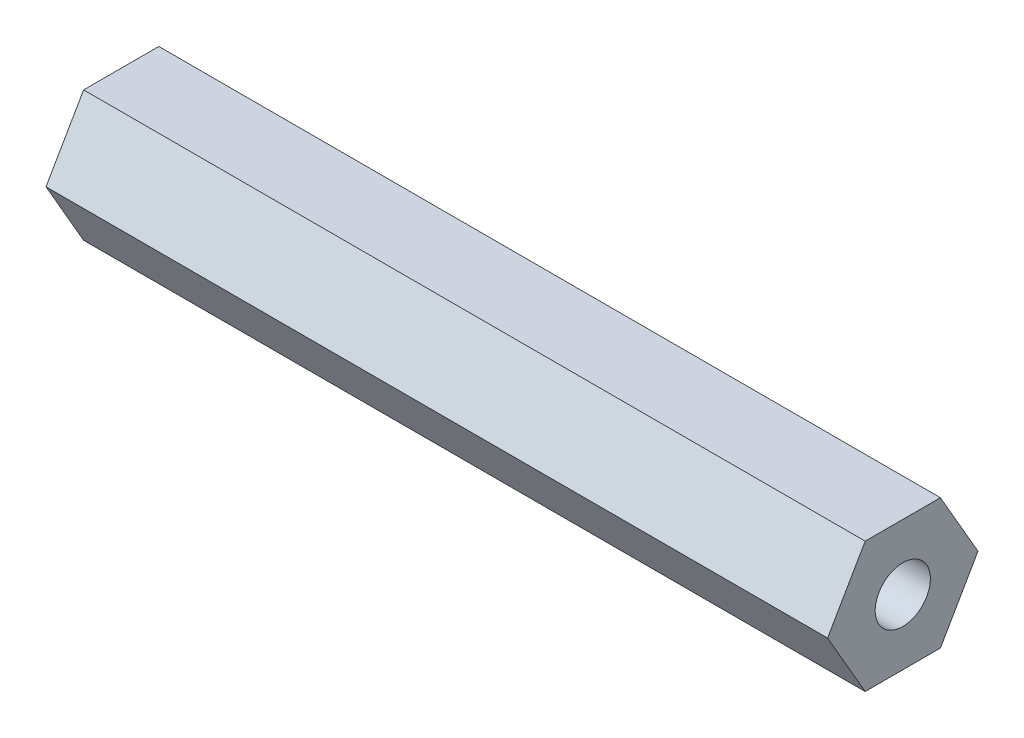
ISO-10303-21;
HEADER;
FILE_DESCRIPTION(('STEP AP214'),'2;1');
FILE_NAME('part.step','',(''),(''),'','','');
FILE_SCHEMA(('AUTOMOTIVE_DESIGN { 1 0 10303 214 1 1 1 1 }'));
ENDSEC;
DATA;
#1=APPLICATION_CONTEXT('core data for automotive mechanical design processes');
#2=APPLICATION_PROTOCOL_DEFINITION('international standard','automotive_design',2000,#1);
#3=PRODUCT_CONTEXT('',#1,'mechanical');
#4=PRODUCT('Part','Part','',(#3));
#5=PRODUCT_RELATED_PRODUCT_CATEGORY('part','',(#4));
#6=PRODUCT_DEFINITION_FORMATION('','',#4);
#7=PRODUCT_DEFINITION_CONTEXT('part definition',#1,'design');
#8=PRODUCT_DEFINITION('design','',#6,#7);
#9=PRODUCT_DEFINITION_SHAPE('','',#8);
#10=(LENGTH_UNIT() NAMED_UNIT(*) SI_UNIT(.MILLI.,.METRE.));
#11=(NAMED_UNIT(*) PLANE_ANGLE_UNIT() SI_UNIT($,.RADIAN.));
#12=(NAMED_UNIT(*) SI_UNIT($,.STERADIAN.) SOLID_ANGLE_UNIT());
#13=UNCERTAINTY_MEASURE_WITH_UNIT(LENGTH_MEASURE(1.E-05),#10,'distance_accuracy_value','');
#14=(GEOMETRIC_REPRESENTATION_CONTEXT(3) GLOBAL_UNCERTAINTY_ASSIGNED_CONTEXT((#13)) GLOBAL_UNIT_ASSIGNED_CONTEXT((#10,
#11,#12)) REPRESENTATION_CONTEXT('',''));
#15=CARTESIAN_POINT('',(0.,0.,0.));
#16=DIRECTION('',(0.,0.,1.));
#17=DIRECTION('',(1.,0.,0.));
#18=AXIS2_PLACEMENT_3D('',#15,#16,#17);
#19=CARTESIAN_POINT('',(38.1,0.,0.));
#20=DIRECTION('',(1.,0.,0.));
#21=DIRECTION('',(0.,1.,0.));
#22=AXIS2_PLACEMENT_3D('',#19,#20,#21);
#23=PLANE('',#22);
#24=CARTESIAN_POINT('',(38.1,0.,0.));
#25=DIRECTION('',(1.,0.,0.));
#26=DIRECTION('',(0.,0.,-1.));
#27=AXIS2_PLACEMENT_3D('',#24,#25,#26);
#28=CIRCLE('',#27,2.0193);
#29=CARTESIAN_POINT('',(38.1,0.,-2.0193));
#30=VERTEX_POINT('',#29);
#31=EDGE_CURVE('E172',#30,#30,#28,.T.);
#32=ORIENTED_EDGE('',*,*,#31,.F.);
#33=EDGE_LOOP('',(#32));
#34=FACE_BOUND('',#33,.T.);
#35=DIRECTION('',(0.,0.866025403784442,-0.5));
#36=VECTOR('',#35,1.);
#37=CARTESIAN_POINT('',(38.1,-4.7625,-2.74963065701564));
#38=LINE('',#37,#36);
#39=CARTESIAN_POINT('',(38.1,-4.7625,-2.74963065701564));
#40=VERTEX_POINT('',#39);
#41=CARTESIAN_POINT('',(38.1,0.,-5.49926131403117));
#42=VERTEX_POINT('',#41);
#43=EDGE_CURVE('E168',#40,#42,#38,.T.);
#44=ORIENTED_EDGE('',*,*,#43,.T.);
#45=DIRECTION('',(0.,0.866025403784438,0.5));
#46=VECTOR('',#45,1.);
#47=CARTESIAN_POINT('',(38.1,0.,-5.49926131403117));
#48=LINE('',#47,#46);
#49=CARTESIAN_POINT('',(38.1,4.7625,-2.74963065701557));
#50=VERTEX_POINT('',#49);
#51=EDGE_CURVE('E103',#42,#50,#48,.T.);
#52=ORIENTED_EDGE('',*,*,#51,.T.);
#53=DIRECTION('',(0.,0.,1.));
#54=VECTOR('',#53,1.);
#55=CARTESIAN_POINT('',(38.1,4.7625,-2.74963065701557));
#56=LINE('',#55,#54);
#57=CARTESIAN_POINT('',(38.1,4.7625,2.7496306570156));
#58=VERTEX_POINT('',#57);
#59=EDGE_CURVE('E145',#50,#58,#56,.T.);
#60=ORIENTED_EDGE('',*,*,#59,.T.);
#61=DIRECTION('',(0.,-0.866025403784442,0.5));
#62=VECTOR('',#61,1.);
#63=CARTESIAN_POINT('',(38.1,4.7625,2.7496306570156));
#64=LINE('',#63,#62);
#65=CARTESIAN_POINT('',(38.1,0.,5.49926131403117));
#66=VERTEX_POINT('',#65);
#67=EDGE_CURVE('E142',#58,#66,#64,.T.);
#68=ORIENTED_EDGE('',*,*,#67,.T.);
#69=DIRECTION('',(0.,-0.866025403784435,-0.500000000000007));
#70=VECTOR('',#69,1.);
#71=CARTESIAN_POINT('',(38.1,0.,5.49926131403117));
#72=LINE('',#71,#70);
#73=CARTESIAN_POINT('',(38.1,-4.7625,2.74963065701554));
#74=VERTEX_POINT('',#73);
#75=EDGE_CURVE('E163',#66,#74,#72,.T.);
#76=ORIENTED_EDGE('',*,*,#75,.T.);
#77=DIRECTION('',(0.,0.,-1.));
#78=VECTOR('',#77,1.);
#79=CARTESIAN_POINT('',(38.1,-4.7625,2.74963065701554));
#80=LINE('',#79,#78);
#81=EDGE_CURVE('E56',#74,#40,#80,.T.);
#82=ORIENTED_EDGE('',*,*,#81,.T.);
#83=EDGE_LOOP('',(#44,#52,#60,#68,#76,#82));
#84=FACE_BOUND('',#83,.T.);
#85=ADVANCED_FACE('F47',(#34,#84),#23,.T.);
#86=CARTESIAN_POINT('',(38.1,-4.7625,2.74963065701554));
#87=DIRECTION('',(0.,1.,0.));
#88=DIRECTION('',(0.,0.,-1.));
#89=AXIS2_PLACEMENT_3D('',#86,#87,#88);
#90=PLANE('',#89);
#91=DIRECTION('',(-1.,0.,0.));
#92=VECTOR('',#91,1.);
#93=CARTESIAN_POINT('',(38.1,-4.7625,2.74963065701554));
#94=LINE('',#93,#92);
#95=CARTESIAN_POINT('',(-19.05,-4.76250000000003,2.74963065701553));
#96=VERTEX_POINT('',#95);
#97=EDGE_CURVE('E160',#74,#96,#94,.T.);
#98=ORIENTED_EDGE('',*,*,#97,.T.);
#99=DIRECTION('',(0.,0.,-1.));
#100=VECTOR('',#99,1.);
#101=CARTESIAN_POINT('',(-19.05,-4.7625,-5.49926131403119));
#102=LINE('',#101,#100);
#103=CARTESIAN_POINT('',(-19.05,-4.76250000000001,-2.74963065701564));
#104=VERTEX_POINT('',#103);
#105=EDGE_CURVE('E138',#96,#104,#102,.T.);
#106=ORIENTED_EDGE('',*,*,#105,.T.);
#107=DIRECTION('',(-1.,0.,0.));
#108=VECTOR('',#107,1.);
#109=CARTESIAN_POINT('',(38.1,-4.7625,-2.74963065701564));
#110=LINE('',#109,#108);
#111=EDGE_CURVE('E159',#40,#104,#110,.T.);
#112=ORIENTED_EDGE('',*,*,#111,.F.);
#113=ORIENTED_EDGE('',*,*,#81,.F.);
#114=EDGE_LOOP('',(#98,#106,#112,#113));
#115=FACE_BOUND('',#114,.T.);
#116=ADVANCED_FACE('F195',(#115),#90,.F.);
#117=CARTESIAN_POINT('',(38.1,0.,5.49926131403117));
#118=DIRECTION('',(0.,0.500000000000007,-0.866025403784435));
#119=DIRECTION('',(-1.,0.,0.));
#120=AXIS2_PLACEMENT_3D('',#117,#118,#119);
#121=PLANE('',#120);
#122=DIRECTION('',(-1.,0.,0.));
#123=VECTOR('',#122,1.);
#124=CARTESIAN_POINT('',(38.1,0.,5.49926131403117));
#125=LINE('',#124,#123);
#126=CARTESIAN_POINT('',(-19.05,0.,5.49926131403117));
#127=VERTEX_POINT('',#126);
#128=EDGE_CURVE('E150',#66,#127,#125,.T.);
#129=ORIENTED_EDGE('',*,*,#128,.T.);
#130=DIRECTION('',(0.,-0.866025403784435,-0.500000000000007));
#131=VECTOR('',#130,1.);
#132=CARTESIAN_POINT('',(-19.05,0.,5.49926131403117));
#133=LINE('',#132,#131);
#134=EDGE_CURVE('E124',#127,#96,#133,.T.);
#135=ORIENTED_EDGE('',*,*,#134,.T.);
#136=ORIENTED_EDGE('',*,*,#97,.F.);
#137=ORIENTED_EDGE('',*,*,#75,.F.);
#138=EDGE_LOOP('',(#129,#135,#136,#137));
#139=FACE_BOUND('',#138,.T.);
#140=ADVANCED_FACE('F49',(#139),#121,.F.);
#141=CARTESIAN_POINT('',(38.1,4.7625,2.7496306570156));
#142=DIRECTION('',(0.,-0.5,-0.866025403784442));
#143=DIRECTION('',(0.,-0.866025403784442,0.5));
#144=AXIS2_PLACEMENT_3D('',#141,#142,#143);
#145=PLANE('',#144);
#146=DIRECTION('',(-1.,0.,0.));
#147=VECTOR('',#146,1.);
#148=CARTESIAN_POINT('',(38.1,4.7625,2.7496306570156));
#149=LINE('',#148,#147);
#150=CARTESIAN_POINT('',(-19.05,4.76249999999998,2.7496306570156));
#151=VERTEX_POINT('',#150);
#152=EDGE_CURVE('E135',#58,#151,#149,.T.);
#153=ORIENTED_EDGE('',*,*,#152,.T.);
#154=DIRECTION('',(0.,-0.866025403784439,0.499999999999999));
#155=VECTOR('',#154,1.);
#156=CARTESIAN_POINT('',(-19.05,4.7625,2.7496306570156));
#157=LINE('',#156,#155);
#158=EDGE_CURVE('E119',#151,#127,#157,.T.);
#159=ORIENTED_EDGE('',*,*,#158,.T.);
#160=ORIENTED_EDGE('',*,*,#128,.F.);
#161=ORIENTED_EDGE('',*,*,#67,.F.);
#162=EDGE_LOOP('',(#153,#159,#160,#161));
#163=FACE_BOUND('',#162,.T.);
#164=ADVANCED_FACE('F140',(#163),#145,.F.);
#165=CARTESIAN_POINT('',(38.1,4.7625,-2.74963065701557));
#166=DIRECTION('',(0.,-1.,0.));
#167=DIRECTION('',(0.,0.,-1.));
#168=AXIS2_PLACEMENT_3D('',#165,#166,#167);
#169=PLANE('',#168);
#170=DIRECTION('',(-1.,0.,0.));
#171=VECTOR('',#170,1.);
#172=CARTESIAN_POINT('',(38.1,4.7625,-2.74963065701557));
#173=LINE('',#172,#171);
#174=CARTESIAN_POINT('',(-19.05,4.7625,-2.74963065701558));
#175=VERTEX_POINT('',#174);
#176=EDGE_CURVE('E136',#50,#175,#173,.T.);
#177=ORIENTED_EDGE('',*,*,#176,.T.);
#178=DIRECTION('',(0.,0.,-1.));
#179=VECTOR('',#178,1.);
#180=CARTESIAN_POINT('',(-19.05,4.76250000000001,-5.49926131403115));
#181=LINE('',#180,#179);
#182=EDGE_CURVE('E122',#151,#175,#181,.T.);
#183=ORIENTED_EDGE('',*,*,#182,.F.);
#184=ORIENTED_EDGE('',*,*,#152,.F.);
#185=ORIENTED_EDGE('',*,*,#59,.F.);
#186=EDGE_LOOP('',(#177,#183,#184,#185));
#187=FACE_BOUND('',#186,.T.);
#188=ADVANCED_FACE('F134',(#187),#169,.F.);
#189=CARTESIAN_POINT('',(38.1,0.,-5.49926131403117));
#190=DIRECTION('',(0.,-0.5,0.866025403784438));
#191=DIRECTION('',(-1.,0.,0.));
#192=AXIS2_PLACEMENT_3D('',#189,#190,#191);
#193=PLANE('',#192);
#194=DIRECTION('',(-1.,0.,0.));
#195=VECTOR('',#194,1.);
#196=CARTESIAN_POINT('',(38.1,0.,-5.49926131403117));
#197=LINE('',#196,#195);
#198=CARTESIAN_POINT('',(-19.05,0.,-5.49926131403117));
#199=VERTEX_POINT('',#198);
#200=EDGE_CURVE('E155',#42,#199,#197,.T.);
#201=ORIENTED_EDGE('',*,*,#200,.T.);
#202=DIRECTION('',(0.,0.866025403784438,0.5));
#203=VECTOR('',#202,1.);
#204=CARTESIAN_POINT('',(-19.05,0.,-5.49926131403117));
#205=LINE('',#204,#203);
#206=EDGE_CURVE('E63',#199,#175,#205,.T.);
#207=ORIENTED_EDGE('',*,*,#206,.T.);
#208=ORIENTED_EDGE('',*,*,#176,.F.);
#209=ORIENTED_EDGE('',*,*,#51,.F.);
#210=EDGE_LOOP('',(#201,#207,#208,#209));
#211=FACE_BOUND('',#210,.T.);
#212=ADVANCED_FACE('F201',(#211),#193,.F.);
#213=CARTESIAN_POINT('',(38.1,-4.7625,-2.74963065701564));
#214=DIRECTION('',(0.,0.5,0.866025403784442));
#215=DIRECTION('',(1.,0.,0.));
#216=AXIS2_PLACEMENT_3D('',#213,#214,#215);
#217=PLANE('',#216);
#218=ORIENTED_EDGE('',*,*,#111,.T.);
#219=DIRECTION('',(0.,0.866025403784439,-0.499999999999999));
#220=VECTOR('',#219,1.);
#221=CARTESIAN_POINT('',(-19.05,-4.7625,-2.74963065701564));
#222=LINE('',#221,#220);
#223=EDGE_CURVE('E193',#104,#199,#222,.T.);
#224=ORIENTED_EDGE('',*,*,#223,.T.);
#225=ORIENTED_EDGE('',*,*,#200,.F.);
#226=ORIENTED_EDGE('',*,*,#43,.F.);
#227=EDGE_LOOP('',(#218,#224,#225,#226));
#228=FACE_BOUND('',#227,.T.);
#229=ADVANCED_FACE('F191',(#228),#217,.F.);
#230=CARTESIAN_POINT('',(-19.05,-4.7625,-5.49926131403119));
#231=DIRECTION('',(1.,0.,0.));
#232=DIRECTION('',(0.,0.,-1.));
#233=AXIS2_PLACEMENT_3D('',#230,#231,#232);
#234=PLANE('',#233);
#235=CARTESIAN_POINT('',(-19.05,0.,0.));
#236=DIRECTION('',(1.,0.,0.));
#237=DIRECTION('',(0.,0.,-1.));
#238=AXIS2_PLACEMENT_3D('',#235,#236,#237);
#239=CIRCLE('',#238,2.0193);
#240=CARTESIAN_POINT('',(-19.05,0.,-2.0193));
#241=VERTEX_POINT('',#240);
#242=EDGE_CURVE('E11',#241,#241,#239,.F.);
#243=ORIENTED_EDGE('',*,*,#242,.F.);
#244=EDGE_LOOP('',(#243));
#245=FACE_BOUND('',#244,.T.);
#246=ORIENTED_EDGE('',*,*,#158,.F.);
#247=ORIENTED_EDGE('',*,*,#182,.T.);
#248=ORIENTED_EDGE('',*,*,#206,.F.);
#249=ORIENTED_EDGE('',*,*,#223,.F.);
#250=ORIENTED_EDGE('',*,*,#105,.F.);
#251=ORIENTED_EDGE('',*,*,#134,.F.);
#252=EDGE_LOOP('',(#246,#247,#248,#249,#250,#251));
#253=FACE_BOUND('',#252,.T.);
#254=ADVANCED_FACE('F121',(#245,#253),#234,.F.);
#255=CARTESIAN_POINT('',(-38.1,0.,0.));
#256=DIRECTION('',(-1.,0.,0.));
#257=DIRECTION('',(0.,0.,1.));
#258=AXIS2_PLACEMENT_3D('',#255,#256,#257);
#259=CYLINDRICAL_SURFACE('',#258,2.0193);
#260=ORIENTED_EDGE('',*,*,#31,.T.);
#261=EDGE_LOOP('',(#260));
#262=FACE_BOUND('',#261,.T.);
#263=ORIENTED_EDGE('',*,*,#242,.T.);
#264=EDGE_LOOP('',(#263));
#265=FACE_BOUND('',#264,.T.);
#266=ADVANCED_FACE('F221',(#262,#265),#259,.F.);
#267=CLOSED_SHELL('',(#85,#116,#140,#164,#188,#212,#229,#254,#266));
#268=MANIFOLD_SOLID_BREP('B2',#267);
#269=ADVANCED_BREP_SHAPE_REPRESENTATION('',(#18,#268),#14);
#270=SHAPE_DEFINITION_REPRESENTATION(#9,#269);
ENDSEC;
END-ISO-10303-21;
